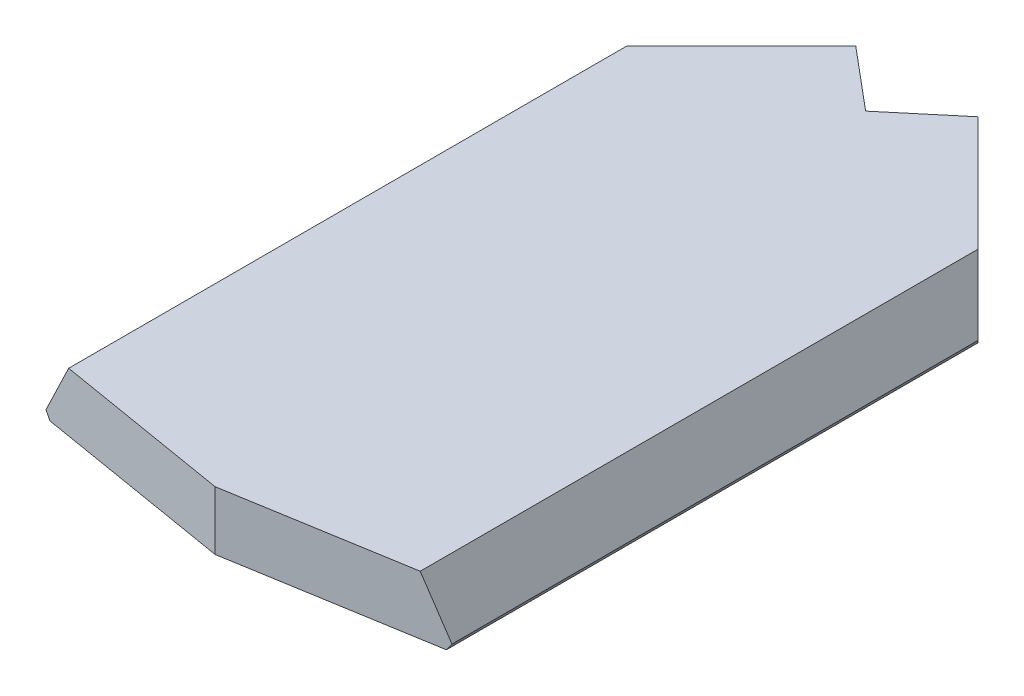
ISO-10303-21;
HEADER;
FILE_DESCRIPTION(('STEP AP214'),'2;1');
FILE_NAME('part.step','',(''),(''),'','','');
FILE_SCHEMA(('AUTOMOTIVE_DESIGN { 1 0 10303 214 1 1 1 1 }'));
ENDSEC;
DATA;
#1=APPLICATION_CONTEXT('core data for automotive mechanical design processes');
#2=APPLICATION_PROTOCOL_DEFINITION('international standard','automotive_design',2000,#1);
#3=PRODUCT_CONTEXT('',#1,'mechanical');
#4=PRODUCT('Part','Part','',(#3));
#5=PRODUCT_RELATED_PRODUCT_CATEGORY('part','',(#4));
#6=PRODUCT_DEFINITION_FORMATION('','',#4);
#7=PRODUCT_DEFINITION_CONTEXT('part definition',#1,'design');
#8=PRODUCT_DEFINITION('design','',#6,#7);
#9=PRODUCT_DEFINITION_SHAPE('','',#8);
#10=(LENGTH_UNIT() NAMED_UNIT(*) SI_UNIT(.MILLI.,.METRE.));
#11=(NAMED_UNIT(*) PLANE_ANGLE_UNIT() SI_UNIT($,.RADIAN.));
#12=(NAMED_UNIT(*) SI_UNIT($,.STERADIAN.) SOLID_ANGLE_UNIT());
#13=UNCERTAINTY_MEASURE_WITH_UNIT(LENGTH_MEASURE(1.E-05),#10,'distance_accuracy_value','');
#14=(GEOMETRIC_REPRESENTATION_CONTEXT(3) GLOBAL_UNCERTAINTY_ASSIGNED_CONTEXT((#13)) GLOBAL_UNIT_ASSIGNED_CONTEXT((#10,
#11,#12)) REPRESENTATION_CONTEXT('',''));
#15=CARTESIAN_POINT('',(0.,0.,0.));
#16=DIRECTION('',(0.,0.,1.));
#17=DIRECTION('',(1.,0.,0.));
#18=AXIS2_PLACEMENT_3D('',#15,#16,#17);
#19=CARTESIAN_POINT('',(-23.9488138453238,0.,56.));
#20=DIRECTION('',(0.,-1.,0.));
#21=DIRECTION('',(1.,0.,0.));
#22=AXIS2_PLACEMENT_3D('',#19,#20,#21);
#23=PLANE('',#22);
#24=DIRECTION('',(0.986336888581285,0.,-0.1647408335046));
#25=VECTOR('',#24,1.);
#26=CARTESIAN_POINT('',(27.6563882159675,0.,51.3807502292866));
#27=LINE('',#26,#25);
#28=CARTESIAN_POINT('',(0.,0.,56.));
#29=VERTEX_POINT('',#28);
#30=CARTESIAN_POINT('',(23.9488138453238,0.,52.));
#31=VERTEX_POINT('',#30);
#32=EDGE_CURVE('E153',#29,#31,#27,.T.);
#33=ORIENTED_EDGE('',*,*,#32,.T.);
#34=DIRECTION('',(0.,0.,-1.));
#35=VECTOR('',#34,1.);
#36=CARTESIAN_POINT('',(23.9488138453238,0.,56.));
#37=LINE('',#36,#35);
#38=CARTESIAN_POINT('',(23.9488138453238,0.,-24.));
#39=VERTEX_POINT('',#38);
#40=EDGE_CURVE('E178',#31,#39,#37,.T.);
#41=ORIENTED_EDGE('',*,*,#40,.T.);
#42=DIRECTION('',(-0.707106781186551,0.,-0.707106781186544));
#43=VECTOR('',#42,1.);
#44=CARTESIAN_POINT('',(8.32674219459322,0.,-39.6220716507304));
#45=LINE('',#44,#43);
#46=CARTESIAN_POINT('',(8.32674219459322,0.,-39.6220716507304));
#47=VERTEX_POINT('',#46);
#48=EDGE_CURVE('E56',#39,#47,#45,.T.);
#49=ORIENTED_EDGE('',*,*,#48,.T.);
#50=DIRECTION('',(-0.766044443118976,0.,0.642787609686541));
#51=VECTOR('',#50,1.);
#52=CARTESIAN_POINT('',(0.,0.,-32.6351053463389));
#53=LINE('',#52,#51);
#54=CARTESIAN_POINT('',(0.,0.,-32.6351053463389));
#55=VERTEX_POINT('',#54);
#56=EDGE_CURVE('E130',#47,#55,#53,.T.);
#57=ORIENTED_EDGE('',*,*,#56,.T.);
#58=DIRECTION('',(-0.766044443118976,0.,-0.642787609686541));
#59=VECTOR('',#58,1.);
#60=CARTESIAN_POINT('',(-8.32674219459322,0.,-39.6220716507304));
#61=LINE('',#60,#59);
#62=CARTESIAN_POINT('',(-8.32674219459322,0.,-39.6220716507304));
#63=VERTEX_POINT('',#62);
#64=EDGE_CURVE('E147',#55,#63,#61,.T.);
#65=ORIENTED_EDGE('',*,*,#64,.T.);
#66=DIRECTION('',(-0.707106781186547,0.,0.707106781186547));
#67=VECTOR('',#66,1.);
#68=CARTESIAN_POINT('',(-27.6563882159675,0.,-20.2924256293562));
#69=LINE('',#68,#67);
#70=CARTESIAN_POINT('',(-23.9488138453238,0.,-23.9999999999998));
#71=VERTEX_POINT('',#70);
#72=EDGE_CURVE('E116',#63,#71,#69,.T.);
#73=ORIENTED_EDGE('',*,*,#72,.T.);
#74=DIRECTION('',(0.,0.,-1.));
#75=VECTOR('',#74,1.);
#76=CARTESIAN_POINT('',(-23.9488138453238,0.,56.));
#77=LINE('',#76,#75);
#78=CARTESIAN_POINT('',(-23.9488138453239,0.,52.));
#79=VERTEX_POINT('',#78);
#80=EDGE_CURVE('E12',#79,#71,#77,.T.);
#81=ORIENTED_EDGE('',*,*,#80,.F.);
#82=DIRECTION('',(0.986336888581285,0.,0.164740833504599));
#83=VECTOR('',#82,1.);
#84=CARTESIAN_POINT('',(0.,0.,56.));
#85=LINE('',#84,#83);
#86=EDGE_CURVE('E150',#79,#29,#85,.T.);
#87=ORIENTED_EDGE('',*,*,#86,.T.);
#88=EDGE_LOOP('',(#33,#41,#49,#57,#65,#73,#81,#87));
#89=FACE_BOUND('',#88,.T.);
#90=ADVANCED_FACE('F34',(#89),#23,.F.);
#91=CARTESIAN_POINT('',(-27.6563882159675,-7.05397538834222,56.));
#92=DIRECTION('',(0.885178967192212,-0.465250680859823,0.));
#93=DIRECTION('',(0.465250680859823,0.885178967192212,0.));
#94=AXIS2_PLACEMENT_3D('',#91,#92,#93);
#95=PLANE('',#94);
#96=DIRECTION('',(-0.463852312484047,-0.882518452494337,-0.0774739518173869));
#97=VECTOR('',#96,1.);
#98=CARTESIAN_POINT('',(-27.4903886772711,-6.73814715581586,51.4084759512816));
#99=LINE('',#98,#97);
#100=CARTESIAN_POINT('',(-27.6563882159675,-7.05397538834222,51.3807502292866));
#101=VERTEX_POINT('',#100);
#102=EDGE_CURVE('E173',#79,#101,#99,.T.);
#103=ORIENTED_EDGE('',*,*,#102,.F.);
#104=ORIENTED_EDGE('',*,*,#80,.T.);
#105=DIRECTION('',(0.421830932420782,0.802569205057126,-0.421830932420782));
#106=VECTOR('',#105,1.);
#107=CARTESIAN_POINT('',(-41.2319643245742,-32.8826628749412,-6.71684952074943));
#108=LINE('',#107,#106);
#109=CARTESIAN_POINT('',(-27.6563882159675,-7.05397538834224,-20.2924256293562));
#110=VERTEX_POINT('',#109);
#111=EDGE_CURVE('E165',#110,#71,#108,.T.);
#112=ORIENTED_EDGE('',*,*,#111,.F.);
#113=DIRECTION('',(0.,0.,-1.));
#114=VECTOR('',#113,1.);
#115=CARTESIAN_POINT('',(-27.6563882159675,-7.05397538834222,56.));
#116=LINE('',#115,#114);
#117=EDGE_CURVE('E41',#101,#110,#116,.T.);
#118=ORIENTED_EDGE('',*,*,#117,.F.);
#119=EDGE_LOOP('',(#103,#104,#112,#118));
#120=FACE_BOUND('',#119,.T.);
#121=ADVANCED_FACE('F195',(#120),#95,.F.);
#122=CARTESIAN_POINT('',(-27.005057694481,-8.,56.));
#123=DIRECTION('',(0.823660234337943,0.567083607918943,0.));
#124=DIRECTION('',(-0.567083607918943,0.823660234337943,0.));
#125=AXIS2_PLACEMENT_3D('',#122,#123,#124);
#126=PLANE('',#125);
#127=DIRECTION('',(0.564556911172482,-0.819990335216844,0.0942939245039419));
#128=VECTOR('',#127,1.);
#129=CARTESIAN_POINT('',(-26.7649464314229,-8.34874945499369,51.5296414086664));
#130=LINE('',#129,#128);
#131=CARTESIAN_POINT('',(-27.005057694481,-8.,51.4895373325967));
#132=VERTEX_POINT('',#131);
#133=EDGE_CURVE('E171',#101,#132,#130,.T.);
#134=ORIENTED_EDGE('',*,*,#133,.F.);
#135=ORIENTED_EDGE('',*,*,#117,.T.);
#136=DIRECTION('',(-0.493287076397114,0.716474507933936,0.493287076397114));
#137=VECTOR('',#136,1.);
#138=CARTESIAN_POINT('',(-45.7279465183301,19.1940482510632,-2.2208673269936));
#139=LINE('',#138,#137);
#140=CARTESIAN_POINT('',(-27.005057694481,-8.,-20.9437561508427));
#141=VERTEX_POINT('',#140);
#142=EDGE_CURVE('E160',#141,#110,#139,.T.);
#143=ORIENTED_EDGE('',*,*,#142,.F.);
#144=DIRECTION('',(0.,0.,-1.));
#145=VECTOR('',#144,1.);
#146=CARTESIAN_POINT('',(-27.005057694481,-8.,56.));
#147=LINE('',#146,#145);
#148=EDGE_CURVE('E137',#132,#141,#147,.T.);
#149=ORIENTED_EDGE('',*,*,#148,.F.);
#150=EDGE_LOOP('',(#134,#135,#143,#149));
#151=FACE_BOUND('',#150,.T.);
#152=ADVANCED_FACE('F191',(#151),#126,.F.);
#153=CARTESIAN_POINT('',(27.005057694481,-8.,56.));
#154=DIRECTION('',(0.,1.,0.));
#155=DIRECTION('',(-1.,0.,0.));
#156=AXIS2_PLACEMENT_3D('',#153,#154,#155);
#157=PLANE('',#156);
#158=DIRECTION('',(0.986336888581285,0.,-0.1647408335046));
#159=VECTOR('',#158,1.);
#160=CARTESIAN_POINT('',(27.6563882159675,-8.,51.3807502292866));
#161=LINE('',#160,#159);
#162=CARTESIAN_POINT('',(0.,-8.,56.));
#163=VERTEX_POINT('',#162);
#164=CARTESIAN_POINT('',(27.005057694481,-8.,51.4895373325967));
#165=VERTEX_POINT('',#164);
#166=EDGE_CURVE('E140',#163,#165,#161,.T.);
#167=ORIENTED_EDGE('',*,*,#166,.F.);
#168=DIRECTION('',(0.986336888581285,0.,0.164740833504599));
#169=VECTOR('',#168,1.);
#170=CARTESIAN_POINT('',(0.,-8.,56.));
#171=LINE('',#170,#169);
#172=EDGE_CURVE('E138',#132,#163,#171,.T.);
#173=ORIENTED_EDGE('',*,*,#172,.F.);
#174=ORIENTED_EDGE('',*,*,#148,.T.);
#175=DIRECTION('',(-0.707106781186547,0.,0.707106781186547));
#176=VECTOR('',#175,1.);
#177=CARTESIAN_POINT('',(-27.6563882159675,-8.,-20.2924256293562));
#178=LINE('',#177,#176);
#179=CARTESIAN_POINT('',(-8.32674219459322,-8.,-39.6220716507304));
#180=VERTEX_POINT('',#179);
#181=EDGE_CURVE('E113',#180,#141,#178,.T.);
#182=ORIENTED_EDGE('',*,*,#181,.F.);
#183=DIRECTION('',(-0.766044443118976,0.,-0.642787609686541));
#184=VECTOR('',#183,1.);
#185=CARTESIAN_POINT('',(-8.32674219459322,-8.,-39.6220716507304));
#186=LINE('',#185,#184);
#187=CARTESIAN_POINT('',(0.,-8.,-32.6351053463389));
#188=VERTEX_POINT('',#187);
#189=EDGE_CURVE('E124',#188,#180,#186,.T.);
#190=ORIENTED_EDGE('',*,*,#189,.F.);
#191=DIRECTION('',(-0.766044443118976,0.,0.642787609686541));
#192=VECTOR('',#191,1.);
#193=CARTESIAN_POINT('',(0.,-8.,-32.6351053463389));
#194=LINE('',#193,#192);
#195=CARTESIAN_POINT('',(8.32674219459322,-8.,-39.6220716507304));
#196=VERTEX_POINT('',#195);
#197=EDGE_CURVE('E121',#196,#188,#194,.T.);
#198=ORIENTED_EDGE('',*,*,#197,.F.);
#199=DIRECTION('',(-0.707106781186551,0.,-0.707106781186544));
#200=VECTOR('',#199,1.);
#201=CARTESIAN_POINT('',(8.32674219459322,-8.,-39.6220716507304));
#202=LINE('',#201,#200);
#203=CARTESIAN_POINT('',(27.005057694481,-8.,-20.9437561508429));
#204=VERTEX_POINT('',#203);
#205=EDGE_CURVE('E144',#204,#196,#202,.T.);
#206=ORIENTED_EDGE('',*,*,#205,.F.);
#207=DIRECTION('',(0.,0.,-1.));
#208=VECTOR('',#207,1.);
#209=CARTESIAN_POINT('',(27.005057694481,-8.,56.));
#210=LINE('',#209,#208);
#211=EDGE_CURVE('E184',#165,#204,#210,.T.);
#212=ORIENTED_EDGE('',*,*,#211,.F.);
#213=EDGE_LOOP('',(#167,#173,#174,#182,#190,#198,#206,#212));
#214=FACE_BOUND('',#213,.T.);
#215=ADVANCED_FACE('F134',(#214),#157,.F.);
#216=CARTESIAN_POINT('',(27.6563882159675,-7.05397538834222,56.));
#217=DIRECTION('',(-0.823660234337943,0.567083607918943,0.));
#218=DIRECTION('',(-0.567083607918943,-0.823660234337943,0.));
#219=AXIS2_PLACEMENT_3D('',#216,#217,#218);
#220=PLANE('',#219);
#221=DIRECTION('',(-0.493287076397115,-0.716474507933938,-0.49328707639711));
#222=VECTOR('',#221,1.);
#223=CARTESIAN_POINT('',(46.220787390345,19.9098746697192,-1.72802645497911));
#224=LINE('',#223,#222);
#225=CARTESIAN_POINT('',(27.6563882159675,-7.05397538834223,-20.2924256293564));
#226=VERTEX_POINT('',#225);
#227=EDGE_CURVE('E169',#226,#204,#224,.T.);
#228=ORIENTED_EDGE('',*,*,#227,.F.);
#229=DIRECTION('',(0.,0.,-1.));
#230=VECTOR('',#229,1.);
#231=CARTESIAN_POINT('',(27.6563882159675,-7.05397538834222,56.));
#232=LINE('',#231,#230);
#233=CARTESIAN_POINT('',(27.6563882159675,-7.05397538834222,51.3807502292866));
#234=VERTEX_POINT('',#233);
#235=EDGE_CURVE('E181',#234,#226,#232,.T.);
#236=ORIENTED_EDGE('',*,*,#235,.F.);
#237=DIRECTION('',(0.564556911172482,0.819990335216844,-0.0942939245039421));
#238=VECTOR('',#237,1.);
#239=CARTESIAN_POINT('',(27.410485749056,-7.41113627377828,51.4218215689362));
#240=LINE('',#239,#238);
#241=EDGE_CURVE('E48',#165,#234,#240,.T.);
#242=ORIENTED_EDGE('',*,*,#241,.F.);
#243=ORIENTED_EDGE('',*,*,#211,.T.);
#244=EDGE_LOOP('',(#228,#236,#242,#243));
#245=FACE_BOUND('',#244,.T.);
#246=ADVANCED_FACE('F206',(#245),#220,.F.);
#247=CARTESIAN_POINT('',(23.9488138453238,0.,56.));
#248=DIRECTION('',(-0.885178967192212,-0.465250680859823,0.));
#249=DIRECTION('',(0.465250680859823,-0.885178967192212,0.));
#250=AXIS2_PLACEMENT_3D('',#247,#248,#249);
#251=PLANE('',#250);
#252=DIRECTION('',(0.421830932420782,-0.802569205057128,0.421830932420778));
#253=VECTOR('',#252,1.);
#254=CARTESIAN_POINT('',(38.1841206890826,-27.0838812881161,-9.76469315624136));
#255=LINE('',#254,#253);
#256=EDGE_CURVE('E167',#39,#226,#255,.T.);
#257=ORIENTED_EDGE('',*,*,#256,.F.);
#258=ORIENTED_EDGE('',*,*,#40,.F.);
#259=DIRECTION('',(-0.463852312484047,0.882518452494337,0.077473951817387));
#260=VECTOR('',#259,1.);
#261=CARTESIAN_POINT('',(23.8050679584927,0.273488768266004,52.0240088528408));
#262=LINE('',#261,#260);
#263=EDGE_CURVE('E175',#234,#31,#262,.T.);
#264=ORIENTED_EDGE('',*,*,#263,.F.);
#265=ORIENTED_EDGE('',*,*,#235,.T.);
#266=EDGE_LOOP('',(#257,#258,#264,#265));
#267=FACE_BOUND('',#266,.T.);
#268=ADVANCED_FACE('F209',(#267),#251,.F.);
#269=CARTESIAN_POINT('',(27.6563882159675,-8.,51.3807502292866));
#270=DIRECTION('',(0.1647408335046,0.,0.986336888581285));
#271=DIRECTION('',(0.986336888581285,0.,-0.1647408335046));
#272=AXIS2_PLACEMENT_3D('',#269,#270,#271);
#273=PLANE('',#272);
#274=ORIENTED_EDGE('',*,*,#241,.T.);
#275=ORIENTED_EDGE('',*,*,#263,.T.);
#276=ORIENTED_EDGE('',*,*,#32,.F.);
#277=DIRECTION('',(0.,1.,0.));
#278=VECTOR('',#277,1.);
#279=CARTESIAN_POINT('',(0.,-8.,56.));
#280=LINE('',#279,#278);
#281=EDGE_CURVE('E120',#163,#29,#280,.T.);
#282=ORIENTED_EDGE('',*,*,#281,.F.);
#283=ORIENTED_EDGE('',*,*,#166,.T.);
#284=EDGE_LOOP('',(#274,#275,#276,#282,#283));
#285=FACE_BOUND('',#284,.T.);
#286=ADVANCED_FACE('F212',(#285),#273,.T.);
#287=CARTESIAN_POINT('',(0.,-8.,56.));
#288=DIRECTION('',(-0.164740833504599,0.,0.986336888581285));
#289=DIRECTION('',(0.986336888581285,0.,0.164740833504599));
#290=AXIS2_PLACEMENT_3D('',#287,#288,#289);
#291=PLANE('',#290);
#292=ORIENTED_EDGE('',*,*,#102,.T.);
#293=ORIENTED_EDGE('',*,*,#133,.T.);
#294=ORIENTED_EDGE('',*,*,#172,.T.);
#295=ORIENTED_EDGE('',*,*,#281,.T.);
#296=ORIENTED_EDGE('',*,*,#86,.F.);
#297=EDGE_LOOP('',(#292,#293,#294,#295,#296));
#298=FACE_BOUND('',#297,.T.);
#299=ADVANCED_FACE('F215',(#298),#291,.T.);
#300=CARTESIAN_POINT('',(8.32674219459322,-8.,-39.6220716507304));
#301=DIRECTION('',(0.707106781186544,0.,-0.707106781186551));
#302=DIRECTION('',(-0.707106781186551,0.,-0.707106781186544));
#303=AXIS2_PLACEMENT_3D('',#300,#301,#302);
#304=PLANE('',#303);
#305=ORIENTED_EDGE('',*,*,#227,.T.);
#306=ORIENTED_EDGE('',*,*,#205,.T.);
#307=DIRECTION('',(0.,1.,0.));
#308=VECTOR('',#307,1.);
#309=CARTESIAN_POINT('',(8.32674219459322,-8.,-39.6220716507304));
#310=LINE('',#309,#308);
#311=EDGE_CURVE('E161',#196,#47,#310,.T.);
#312=ORIENTED_EDGE('',*,*,#311,.T.);
#313=ORIENTED_EDGE('',*,*,#48,.F.);
#314=ORIENTED_EDGE('',*,*,#256,.T.);
#315=EDGE_LOOP('',(#305,#306,#312,#313,#314));
#316=FACE_BOUND('',#315,.T.);
#317=ADVANCED_FACE('F217',(#316),#304,.T.);
#318=CARTESIAN_POINT('',(-27.6563882159675,-8.,-20.2924256293562));
#319=DIRECTION('',(-0.707106781186548,0.,-0.707106781186547));
#320=DIRECTION('',(-0.707106781186547,0.,0.707106781186548));
#321=AXIS2_PLACEMENT_3D('',#318,#319,#320);
#322=PLANE('',#321);
#323=ORIENTED_EDGE('',*,*,#111,.T.);
#324=ORIENTED_EDGE('',*,*,#72,.F.);
#325=DIRECTION('',(0.,1.,0.));
#326=VECTOR('',#325,1.);
#327=CARTESIAN_POINT('',(-8.32674219459322,-8.,-39.6220716507304));
#328=LINE('',#327,#326);
#329=EDGE_CURVE('E109',#180,#63,#328,.T.);
#330=ORIENTED_EDGE('',*,*,#329,.F.);
#331=ORIENTED_EDGE('',*,*,#181,.T.);
#332=ORIENTED_EDGE('',*,*,#142,.T.);
#333=EDGE_LOOP('',(#323,#324,#330,#331,#332));
#334=FACE_BOUND('',#333,.T.);
#335=ADVANCED_FACE('F111',(#334),#322,.T.);
#336=CARTESIAN_POINT('',(-8.32674219459322,-8.,-39.6220716507304));
#337=DIRECTION('',(0.642787609686541,0.,-0.766044443118976));
#338=DIRECTION('',(-0.766044443118977,0.,-0.642787609686541));
#339=AXIS2_PLACEMENT_3D('',#336,#337,#338);
#340=PLANE('',#339);
#341=ORIENTED_EDGE('',*,*,#64,.F.);
#342=DIRECTION('',(0.,1.,0.));
#343=VECTOR('',#342,1.);
#344=CARTESIAN_POINT('',(0.,-8.,-32.6351053463389));
#345=LINE('',#344,#343);
#346=EDGE_CURVE('E126',#188,#55,#345,.T.);
#347=ORIENTED_EDGE('',*,*,#346,.F.);
#348=ORIENTED_EDGE('',*,*,#189,.T.);
#349=ORIENTED_EDGE('',*,*,#329,.T.);
#350=EDGE_LOOP('',(#341,#347,#348,#349));
#351=FACE_BOUND('',#350,.T.);
#352=ADVANCED_FACE('F125',(#351),#340,.T.);
#353=CARTESIAN_POINT('',(0.,-8.,-32.6351053463389));
#354=DIRECTION('',(-0.642787609686541,0.,-0.766044443118976));
#355=DIRECTION('',(-0.766044443118977,0.,0.642787609686541));
#356=AXIS2_PLACEMENT_3D('',#353,#354,#355);
#357=PLANE('',#356);
#358=ORIENTED_EDGE('',*,*,#56,.F.);
#359=ORIENTED_EDGE('',*,*,#311,.F.);
#360=ORIENTED_EDGE('',*,*,#197,.T.);
#361=ORIENTED_EDGE('',*,*,#346,.T.);
#362=EDGE_LOOP('',(#358,#359,#360,#361));
#363=FACE_BOUND('',#362,.T.);
#364=ADVANCED_FACE('F201',(#363),#357,.T.);
#365=CLOSED_SHELL('',(#90,#121,#152,#215,#246,#268,#286,#299,#317,#335,#352,#364));
#366=MANIFOLD_SOLID_BREP('B2',#365);
#367=ADVANCED_BREP_SHAPE_REPRESENTATION('',(#18,#366),#14);
#368=SHAPE_DEFINITION_REPRESENTATION(#9,#367);
ENDSEC;
END-ISO-10303-21;
